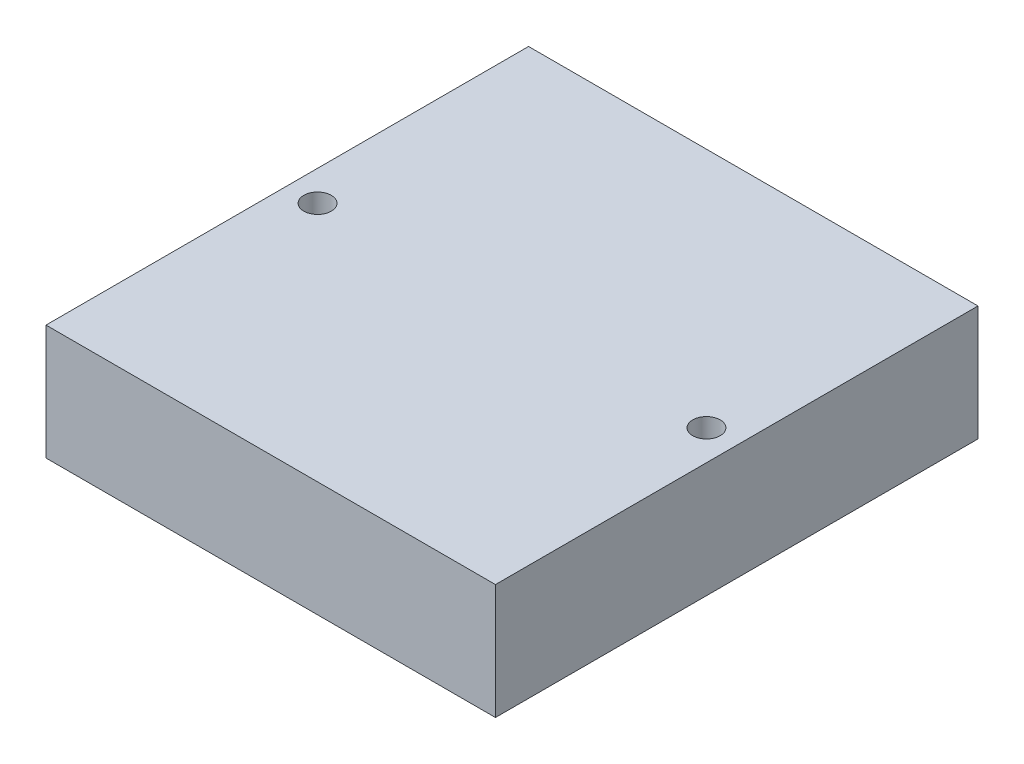
ISO-10303-21;
HEADER;
FILE_DESCRIPTION(('STEP AP214'),'2;1');
FILE_NAME('part.step','',(''),(''),'','','');
FILE_SCHEMA(('AUTOMOTIVE_DESIGN { 1 0 10303 214 1 1 1 1 }'));
ENDSEC;
DATA;
#1=APPLICATION_CONTEXT('core data for automotive mechanical design processes');
#2=APPLICATION_PROTOCOL_DEFINITION('international standard','automotive_design',2000,#1);
#3=PRODUCT_CONTEXT('',#1,'mechanical');
#4=PRODUCT('Part','Part','',(#3));
#5=PRODUCT_RELATED_PRODUCT_CATEGORY('part','',(#4));
#6=PRODUCT_DEFINITION_FORMATION('','',#4);
#7=PRODUCT_DEFINITION_CONTEXT('part definition',#1,'design');
#8=PRODUCT_DEFINITION('design','',#6,#7);
#9=PRODUCT_DEFINITION_SHAPE('','',#8);
#10=(LENGTH_UNIT() NAMED_UNIT(*) SI_UNIT(.MILLI.,.METRE.));
#11=(NAMED_UNIT(*) PLANE_ANGLE_UNIT() SI_UNIT($,.RADIAN.));
#12=(NAMED_UNIT(*) SI_UNIT($,.STERADIAN.) SOLID_ANGLE_UNIT());
#13=UNCERTAINTY_MEASURE_WITH_UNIT(LENGTH_MEASURE(1.E-05),#10,'distance_accuracy_value','');
#14=(GEOMETRIC_REPRESENTATION_CONTEXT(3) GLOBAL_UNCERTAINTY_ASSIGNED_CONTEXT((#13)) GLOBAL_UNIT_ASSIGNED_CONTEXT((#10,
#11,#12)) REPRESENTATION_CONTEXT('',''));
#15=CARTESIAN_POINT('',(0.,0.,0.));
#16=DIRECTION('',(0.,0.,1.));
#17=DIRECTION('',(1.,0.,0.));
#18=AXIS2_PLACEMENT_3D('',#15,#16,#17);
#19=CARTESIAN_POINT('',(0.,14.65,0.));
#20=DIRECTION('',(0.,-1.,0.));
#21=DIRECTION('',(0.,0.,-1.));
#22=AXIS2_PLACEMENT_3D('',#19,#20,#21);
#23=PLANE('',#22);
#24=CARTESIAN_POINT('',(-24.735,14.65,0.));
#25=DIRECTION('',(0.,1.,0.));
#26=DIRECTION('',(0.,0.,1.));
#27=AXIS2_PLACEMENT_3D('',#24,#25,#26);
#28=CIRCLE('',#27,1.75);
#29=CARTESIAN_POINT('',(-24.735,14.65,1.75));
#30=VERTEX_POINT('',#29);
#31=EDGE_CURVE('E100',#30,#30,#28,.T.);
#32=ORIENTED_EDGE('',*,*,#31,.F.);
#33=EDGE_LOOP('',(#32));
#34=FACE_BOUND('',#33,.T.);
#35=DIRECTION('',(0.,0.,-1.));
#36=VECTOR('',#35,1.);
#37=CARTESIAN_POINT('',(28.585,14.65,30.69));
#38=LINE('',#37,#36);
#39=CARTESIAN_POINT('',(28.585,14.65,30.69));
#40=VERTEX_POINT('',#39);
#41=CARTESIAN_POINT('',(28.585,14.65,-30.69));
#42=VERTEX_POINT('',#41);
#43=EDGE_CURVE('E85',#40,#42,#38,.T.);
#44=ORIENTED_EDGE('',*,*,#43,.T.);
#45=DIRECTION('',(-1.,0.,0.));
#46=VECTOR('',#45,1.);
#47=CARTESIAN_POINT('',(-28.585,14.65,-30.69));
#48=LINE('',#47,#46);
#49=CARTESIAN_POINT('',(-28.585,14.65,-30.69));
#50=VERTEX_POINT('',#49);
#51=EDGE_CURVE('E80',#42,#50,#48,.T.);
#52=ORIENTED_EDGE('',*,*,#51,.T.);
#53=DIRECTION('',(0.,0.,1.));
#54=VECTOR('',#53,1.);
#55=CARTESIAN_POINT('',(-28.585,14.65,30.69));
#56=LINE('',#55,#54);
#57=CARTESIAN_POINT('',(-28.585,14.65,30.69));
#58=VERTEX_POINT('',#57);
#59=EDGE_CURVE('E83',#50,#58,#56,.T.);
#60=ORIENTED_EDGE('',*,*,#59,.T.);
#61=DIRECTION('',(1.,0.,0.));
#62=VECTOR('',#61,1.);
#63=CARTESIAN_POINT('',(-28.585,14.65,30.69));
#64=LINE('',#63,#62);
#65=EDGE_CURVE('E50',#58,#40,#64,.T.);
#66=ORIENTED_EDGE('',*,*,#65,.T.);
#67=EDGE_LOOP('',(#44,#52,#60,#66));
#68=FACE_BOUND('',#67,.T.);
#69=CARTESIAN_POINT('',(24.735,14.65,0.));
#70=DIRECTION('',(0.,1.,0.));
#71=DIRECTION('',(0.,0.,1.));
#72=AXIS2_PLACEMENT_3D('',#69,#70,#71);
#73=CIRCLE('',#72,1.75);
#74=CARTESIAN_POINT('',(24.735,14.65,1.75));
#75=VERTEX_POINT('',#74);
#76=EDGE_CURVE('E115',#75,#75,#73,.T.);
#77=ORIENTED_EDGE('',*,*,#76,.F.);
#78=EDGE_LOOP('',(#77));
#79=FACE_BOUND('',#78,.T.);
#80=ADVANCED_FACE('F33',(#34,#68,#79),#23,.F.);
#81=CARTESIAN_POINT('',(0.,0.,0.));
#82=DIRECTION('',(0.,-1.,0.));
#83=DIRECTION('',(0.,0.,-1.));
#84=AXIS2_PLACEMENT_3D('',#81,#82,#83);
#85=PLANE('',#84);
#86=CARTESIAN_POINT('',(-24.735,0.,0.));
#87=DIRECTION('',(0.,1.,0.));
#88=DIRECTION('',(0.,0.,1.));
#89=AXIS2_PLACEMENT_3D('',#86,#87,#88);
#90=CIRCLE('',#89,1.75);
#91=CARTESIAN_POINT('',(-24.735,0.,1.75));
#92=VERTEX_POINT('',#91);
#93=EDGE_CURVE('E112',#92,#92,#90,.T.);
#94=ORIENTED_EDGE('',*,*,#93,.T.);
#95=EDGE_LOOP('',(#94));
#96=FACE_BOUND('',#95,.T.);
#97=DIRECTION('',(0.,0.,-1.));
#98=VECTOR('',#97,1.);
#99=CARTESIAN_POINT('',(28.585,0.,30.69));
#100=LINE('',#99,#98);
#101=CARTESIAN_POINT('',(28.585,0.,30.69));
#102=VERTEX_POINT('',#101);
#103=CARTESIAN_POINT('',(28.585,0.,-30.69));
#104=VERTEX_POINT('',#103);
#105=EDGE_CURVE('E97',#102,#104,#100,.T.);
#106=ORIENTED_EDGE('',*,*,#105,.F.);
#107=DIRECTION('',(1.,0.,0.));
#108=VECTOR('',#107,1.);
#109=CARTESIAN_POINT('',(-28.585,0.,30.69));
#110=LINE('',#109,#108);
#111=CARTESIAN_POINT('',(-28.585,0.,30.69));
#112=VERTEX_POINT('',#111);
#113=EDGE_CURVE('E73',#112,#102,#110,.T.);
#114=ORIENTED_EDGE('',*,*,#113,.F.);
#115=DIRECTION('',(0.,0.,1.));
#116=VECTOR('',#115,1.);
#117=CARTESIAN_POINT('',(-28.585,0.,30.69));
#118=LINE('',#117,#116);
#119=CARTESIAN_POINT('',(-28.585,0.,-30.69));
#120=VERTEX_POINT('',#119);
#121=EDGE_CURVE('E67',#120,#112,#118,.T.);
#122=ORIENTED_EDGE('',*,*,#121,.F.);
#123=DIRECTION('',(-1.,0.,0.));
#124=VECTOR('',#123,1.);
#125=CARTESIAN_POINT('',(-28.585,0.,-30.69));
#126=LINE('',#125,#124);
#127=EDGE_CURVE('E89',#104,#120,#126,.T.);
#128=ORIENTED_EDGE('',*,*,#127,.F.);
#129=EDGE_LOOP('',(#106,#114,#122,#128));
#130=FACE_BOUND('',#129,.T.);
#131=CARTESIAN_POINT('',(24.735,0.,0.));
#132=DIRECTION('',(0.,1.,0.));
#133=DIRECTION('',(0.,0.,1.));
#134=AXIS2_PLACEMENT_3D('',#131,#132,#133);
#135=CIRCLE('',#134,1.75);
#136=CARTESIAN_POINT('',(24.735,0.,1.75));
#137=VERTEX_POINT('',#136);
#138=EDGE_CURVE('E118',#137,#137,#135,.T.);
#139=ORIENTED_EDGE('',*,*,#138,.T.);
#140=EDGE_LOOP('',(#139));
#141=FACE_BOUND('',#140,.T.);
#142=ADVANCED_FACE('F108',(#96,#130,#141),#85,.T.);
#143=CARTESIAN_POINT('',(28.585,14.65,30.69));
#144=DIRECTION('',(-1.,0.,0.));
#145=DIRECTION('',(0.,0.,1.));
#146=AXIS2_PLACEMENT_3D('',#143,#144,#145);
#147=PLANE('',#146);
#148=ORIENTED_EDGE('',*,*,#105,.T.);
#149=DIRECTION('',(0.,-1.,0.));
#150=VECTOR('',#149,1.);
#151=CARTESIAN_POINT('',(28.585,14.65,-30.69));
#152=LINE('',#151,#150);
#153=EDGE_CURVE('E11',#42,#104,#152,.T.);
#154=ORIENTED_EDGE('',*,*,#153,.F.);
#155=ORIENTED_EDGE('',*,*,#43,.F.);
#156=DIRECTION('',(0.,-1.,0.));
#157=VECTOR('',#156,1.);
#158=CARTESIAN_POINT('',(28.585,14.65,30.69));
#159=LINE('',#158,#157);
#160=EDGE_CURVE('E93',#40,#102,#159,.T.);
#161=ORIENTED_EDGE('',*,*,#160,.T.);
#162=EDGE_LOOP('',(#148,#154,#155,#161));
#163=FACE_BOUND('',#162,.T.);
#164=ADVANCED_FACE('F35',(#163),#147,.F.);
#165=CARTESIAN_POINT('',(-28.585,14.65,-30.69));
#166=DIRECTION('',(0.,0.,1.));
#167=DIRECTION('',(1.,0.,0.));
#168=AXIS2_PLACEMENT_3D('',#165,#166,#167);
#169=PLANE('',#168);
#170=ORIENTED_EDGE('',*,*,#127,.T.);
#171=DIRECTION('',(0.,-1.,0.));
#172=VECTOR('',#171,1.);
#173=CARTESIAN_POINT('',(-28.585,14.65,-30.69));
#174=LINE('',#173,#172);
#175=EDGE_CURVE('E42',#50,#120,#174,.T.);
#176=ORIENTED_EDGE('',*,*,#175,.F.);
#177=ORIENTED_EDGE('',*,*,#51,.F.);
#178=ORIENTED_EDGE('',*,*,#153,.T.);
#179=EDGE_LOOP('',(#170,#176,#177,#178));
#180=FACE_BOUND('',#179,.T.);
#181=ADVANCED_FACE('F88',(#180),#169,.F.);
#182=CARTESIAN_POINT('',(-28.585,14.65,30.69));
#183=DIRECTION('',(1.,0.,0.));
#184=DIRECTION('',(0.,0.,-1.));
#185=AXIS2_PLACEMENT_3D('',#182,#183,#184);
#186=PLANE('',#185);
#187=ORIENTED_EDGE('',*,*,#121,.T.);
#188=DIRECTION('',(0.,-1.,0.));
#189=VECTOR('',#188,1.);
#190=CARTESIAN_POINT('',(-28.585,14.65,30.69));
#191=LINE('',#190,#189);
#192=EDGE_CURVE('E90',#58,#112,#191,.T.);
#193=ORIENTED_EDGE('',*,*,#192,.F.);
#194=ORIENTED_EDGE('',*,*,#59,.F.);
#195=ORIENTED_EDGE('',*,*,#175,.T.);
#196=EDGE_LOOP('',(#187,#193,#194,#195));
#197=FACE_BOUND('',#196,.T.);
#198=ADVANCED_FACE('F91',(#197),#186,.F.);
#199=CARTESIAN_POINT('',(-28.585,14.65,30.69));
#200=DIRECTION('',(0.,0.,-1.));
#201=DIRECTION('',(-1.,0.,0.));
#202=AXIS2_PLACEMENT_3D('',#199,#200,#201);
#203=PLANE('',#202);
#204=ORIENTED_EDGE('',*,*,#113,.T.);
#205=ORIENTED_EDGE('',*,*,#160,.F.);
#206=ORIENTED_EDGE('',*,*,#65,.F.);
#207=ORIENTED_EDGE('',*,*,#192,.T.);
#208=EDGE_LOOP('',(#204,#205,#206,#207));
#209=FACE_BOUND('',#208,.T.);
#210=ADVANCED_FACE('F105',(#209),#203,.F.);
#211=CARTESIAN_POINT('',(-24.735,14.65,0.));
#212=DIRECTION('',(0.,-1.,0.));
#213=DIRECTION('',(0.,0.,-1.));
#214=AXIS2_PLACEMENT_3D('',#211,#212,#213);
#215=CYLINDRICAL_SURFACE('',#214,1.75);
#216=ORIENTED_EDGE('',*,*,#31,.T.);
#217=EDGE_LOOP('',(#216));
#218=FACE_BOUND('',#217,.T.);
#219=ORIENTED_EDGE('',*,*,#93,.F.);
#220=EDGE_LOOP('',(#219));
#221=FACE_BOUND('',#220,.T.);
#222=ADVANCED_FACE('F136',(#218,#221),#215,.F.);
#223=CARTESIAN_POINT('',(24.735,14.65,0.));
#224=DIRECTION('',(0.,-1.,0.));
#225=DIRECTION('',(0.,0.,-1.));
#226=AXIS2_PLACEMENT_3D('',#223,#224,#225);
#227=CYLINDRICAL_SURFACE('',#226,1.75);
#228=ORIENTED_EDGE('',*,*,#76,.T.);
#229=EDGE_LOOP('',(#228));
#230=FACE_BOUND('',#229,.T.);
#231=ORIENTED_EDGE('',*,*,#138,.F.);
#232=EDGE_LOOP('',(#231));
#233=FACE_BOUND('',#232,.T.);
#234=ADVANCED_FACE('F124',(#230,#233),#227,.F.);
#235=CLOSED_SHELL('',(#80,#142,#164,#181,#198,#210,#222,#234));
#236=MANIFOLD_SOLID_BREP('B2',#235);
#237=ADVANCED_BREP_SHAPE_REPRESENTATION('',(#18,#236),#14);
#238=SHAPE_DEFINITION_REPRESENTATION(#9,#237);
ENDSEC;
END-ISO-10303-21;
